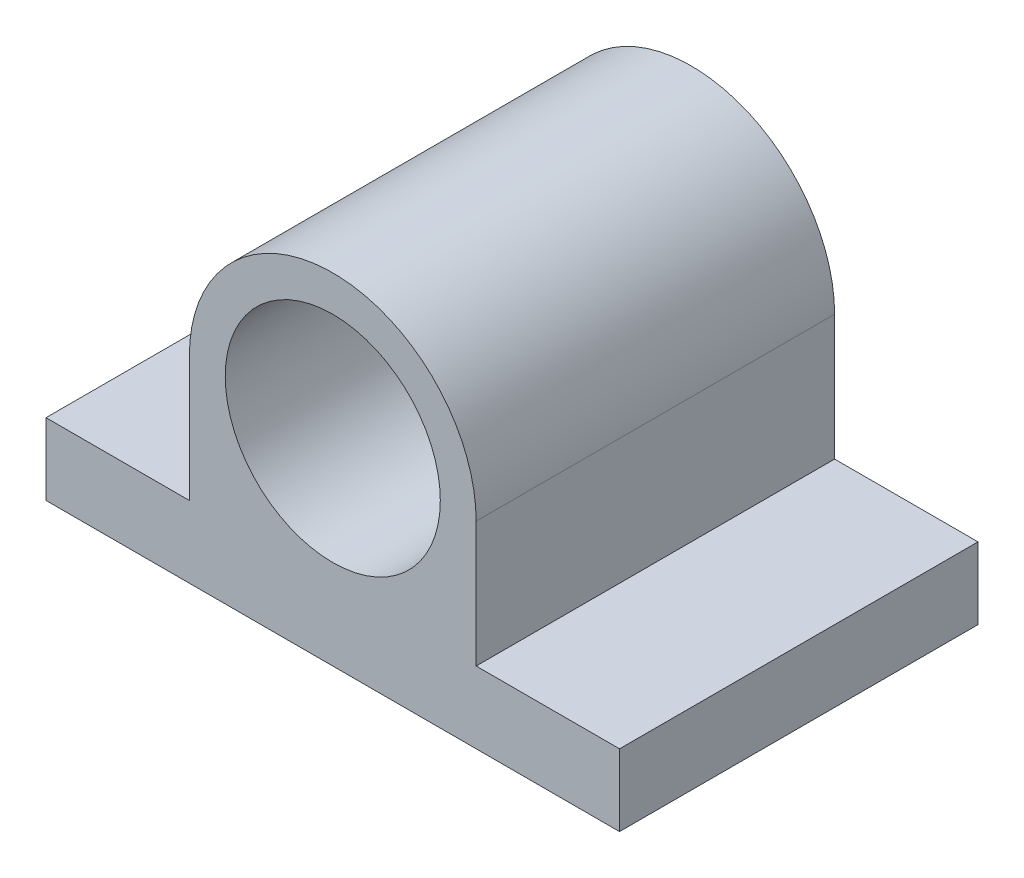
ISO-10303-21;
HEADER;
FILE_DESCRIPTION(('STEP AP214'),'2;1');
FILE_NAME('part.step','',(''),(''),'','','');
FILE_SCHEMA(('AUTOMOTIVE_DESIGN { 1 0 10303 214 1 1 1 1 }'));
ENDSEC;
DATA;
#1=APPLICATION_CONTEXT('core data for automotive mechanical design processes');
#2=APPLICATION_PROTOCOL_DEFINITION('international standard','automotive_design',2000,#1);
#3=PRODUCT_CONTEXT('',#1,'mechanical');
#4=PRODUCT('Part','Part','',(#3));
#5=PRODUCT_RELATED_PRODUCT_CATEGORY('part','',(#4));
#6=PRODUCT_DEFINITION_FORMATION('','',#4);
#7=PRODUCT_DEFINITION_CONTEXT('part definition',#1,'design');
#8=PRODUCT_DEFINITION('design','',#6,#7);
#9=PRODUCT_DEFINITION_SHAPE('','',#8);
#10=(LENGTH_UNIT() NAMED_UNIT(*) SI_UNIT(.MILLI.,.METRE.));
#11=(NAMED_UNIT(*) PLANE_ANGLE_UNIT() SI_UNIT($,.RADIAN.));
#12=(NAMED_UNIT(*) SI_UNIT($,.STERADIAN.) SOLID_ANGLE_UNIT());
#13=UNCERTAINTY_MEASURE_WITH_UNIT(LENGTH_MEASURE(1.E-05),#10,'distance_accuracy_value','');
#14=(GEOMETRIC_REPRESENTATION_CONTEXT(3) GLOBAL_UNCERTAINTY_ASSIGNED_CONTEXT((#13)) GLOBAL_UNIT_ASSIGNED_CONTEXT((#10,
#11,#12)) REPRESENTATION_CONTEXT('',''));
#15=CARTESIAN_POINT('',(0.,0.,0.));
#16=DIRECTION('',(0.,0.,1.));
#17=DIRECTION('',(1.,0.,0.));
#18=AXIS2_PLACEMENT_3D('',#15,#16,#17);
#19=CARTESIAN_POINT('',(40.,27.5,50.));
#20=DIRECTION('',(0.,0.,1.));
#21=DIRECTION('',(1.,0.,0.));
#22=AXIS2_PLACEMENT_3D('',#19,#20,#21);
#23=PLANE('',#22);
#24=DIRECTION('',(0.,-1.,0.));
#25=VECTOR('',#24,1.);
#26=CARTESIAN_POINT('',(0.,0.,50.));
#27=LINE('',#26,#25);
#28=CARTESIAN_POINT('',(0.,10.,50.));
#29=VERTEX_POINT('',#28);
#30=CARTESIAN_POINT('',(0.,0.,50.));
#31=VERTEX_POINT('',#30);
#32=EDGE_CURVE('E145',#29,#31,#27,.T.);
#33=ORIENTED_EDGE('',*,*,#32,.T.);
#34=DIRECTION('',(1.,0.,0.));
#35=VECTOR('',#34,1.);
#36=CARTESIAN_POINT('',(0.,0.,50.));
#37=LINE('',#36,#35);
#38=CARTESIAN_POINT('',(80.,0.,50.));
#39=VERTEX_POINT('',#38);
#40=EDGE_CURVE('E93',#31,#39,#37,.T.);
#41=ORIENTED_EDGE('',*,*,#40,.T.);
#42=DIRECTION('',(0.,1.,0.));
#43=VECTOR('',#42,1.);
#44=CARTESIAN_POINT('',(80.,0.,50.));
#45=LINE('',#44,#43);
#46=CARTESIAN_POINT('',(80.,10.,50.));
#47=VERTEX_POINT('',#46);
#48=EDGE_CURVE('E160',#39,#47,#45,.T.);
#49=ORIENTED_EDGE('',*,*,#48,.T.);
#50=DIRECTION('',(-1.,0.,0.));
#51=VECTOR('',#50,1.);
#52=CARTESIAN_POINT('',(60.,10.,50.));
#53=LINE('',#52,#51);
#54=CARTESIAN_POINT('',(60.,10.,50.));
#55=VERTEX_POINT('',#54);
#56=EDGE_CURVE('E173',#47,#55,#53,.T.);
#57=ORIENTED_EDGE('',*,*,#56,.T.);
#58=DIRECTION('',(0.,1.,0.));
#59=VECTOR('',#58,1.);
#60=CARTESIAN_POINT('',(60.,10.,50.));
#61=LINE('',#60,#59);
#62=CARTESIAN_POINT('',(60.,27.5,50.));
#63=VERTEX_POINT('',#62);
#64=EDGE_CURVE('E112',#55,#63,#61,.T.);
#65=ORIENTED_EDGE('',*,*,#64,.T.);
#66=CARTESIAN_POINT('',(40.,27.5,50.));
#67=DIRECTION('',(0.,0.,1.));
#68=DIRECTION('',(1.,0.,0.));
#69=AXIS2_PLACEMENT_3D('',#66,#67,#68);
#70=CIRCLE('',#69,20.);
#71=CARTESIAN_POINT('',(20.,27.5,50.));
#72=VERTEX_POINT('',#71);
#73=EDGE_CURVE('E106',#63,#72,#70,.T.);
#74=ORIENTED_EDGE('',*,*,#73,.T.);
#75=DIRECTION('',(0.,-1.,0.));
#76=VECTOR('',#75,1.);
#77=CARTESIAN_POINT('',(20.,10.,50.));
#78=LINE('',#77,#76);
#79=CARTESIAN_POINT('',(20.,10.,50.));
#80=VERTEX_POINT('',#79);
#81=EDGE_CURVE('E110',#72,#80,#78,.T.);
#82=ORIENTED_EDGE('',*,*,#81,.T.);
#83=DIRECTION('',(-1.,0.,0.));
#84=VECTOR('',#83,1.);
#85=CARTESIAN_POINT('',(0.,10.,50.));
#86=LINE('',#85,#84);
#87=EDGE_CURVE('E50',#80,#29,#86,.T.);
#88=ORIENTED_EDGE('',*,*,#87,.T.);
#89=EDGE_LOOP('',(#33,#41,#49,#57,#65,#74,#82,#88));
#90=FACE_BOUND('',#89,.T.);
#91=CARTESIAN_POINT('',(40.,27.5,50.));
#92=DIRECTION('',(0.,0.,1.));
#93=DIRECTION('',(1.,0.,0.));
#94=AXIS2_PLACEMENT_3D('',#91,#92,#93);
#95=CIRCLE('',#94,15.);
#96=CARTESIAN_POINT('',(55.,27.5,50.));
#97=VERTEX_POINT('',#96);
#98=EDGE_CURVE('E134',#97,#97,#95,.T.);
#99=ORIENTED_EDGE('',*,*,#98,.F.);
#100=EDGE_LOOP('',(#99));
#101=FACE_BOUND('',#100,.T.);
#102=ADVANCED_FACE('F33',(#90,#101),#23,.T.);
#103=CARTESIAN_POINT('',(40.,27.5,0.));
#104=DIRECTION('',(0.,0.,1.));
#105=DIRECTION('',(1.,0.,0.));
#106=AXIS2_PLACEMENT_3D('',#103,#104,#105);
#107=PLANE('',#106);
#108=DIRECTION('',(0.,-1.,0.));
#109=VECTOR('',#108,1.);
#110=CARTESIAN_POINT('',(0.,0.,0.));
#111=LINE('',#110,#109);
#112=CARTESIAN_POINT('',(0.,10.,0.));
#113=VERTEX_POINT('',#112);
#114=CARTESIAN_POINT('',(0.,0.,0.));
#115=VERTEX_POINT('',#114);
#116=EDGE_CURVE('E130',#113,#115,#111,.T.);
#117=ORIENTED_EDGE('',*,*,#116,.F.);
#118=DIRECTION('',(-1.,0.,0.));
#119=VECTOR('',#118,1.);
#120=CARTESIAN_POINT('',(0.,10.,0.));
#121=LINE('',#120,#119);
#122=CARTESIAN_POINT('',(20.,10.,0.));
#123=VERTEX_POINT('',#122);
#124=EDGE_CURVE('E85',#123,#113,#121,.T.);
#125=ORIENTED_EDGE('',*,*,#124,.F.);
#126=DIRECTION('',(0.,-1.,0.));
#127=VECTOR('',#126,1.);
#128=CARTESIAN_POINT('',(20.,10.,0.));
#129=LINE('',#128,#127);
#130=CARTESIAN_POINT('',(20.,27.5,0.));
#131=VERTEX_POINT('',#130);
#132=EDGE_CURVE('E79',#131,#123,#129,.T.);
#133=ORIENTED_EDGE('',*,*,#132,.F.);
#134=CARTESIAN_POINT('',(40.,27.5,0.));
#135=DIRECTION('',(0.,0.,1.));
#136=DIRECTION('',(1.,0.,0.));
#137=AXIS2_PLACEMENT_3D('',#134,#135,#136);
#138=CIRCLE('',#137,20.);
#139=CARTESIAN_POINT('',(60.,27.5,0.));
#140=VERTEX_POINT('',#139);
#141=EDGE_CURVE('E120',#140,#131,#138,.T.);
#142=ORIENTED_EDGE('',*,*,#141,.F.);
#143=DIRECTION('',(0.,1.,0.));
#144=VECTOR('',#143,1.);
#145=CARTESIAN_POINT('',(60.,10.,0.));
#146=LINE('',#145,#144);
#147=CARTESIAN_POINT('',(60.,10.,0.));
#148=VERTEX_POINT('',#147);
#149=EDGE_CURVE('E140',#148,#140,#146,.T.);
#150=ORIENTED_EDGE('',*,*,#149,.F.);
#151=DIRECTION('',(-1.,0.,0.));
#152=VECTOR('',#151,1.);
#153=CARTESIAN_POINT('',(60.,10.,0.));
#154=LINE('',#153,#152);
#155=CARTESIAN_POINT('',(80.,10.,0.));
#156=VERTEX_POINT('',#155);
#157=EDGE_CURVE('E138',#156,#148,#154,.T.);
#158=ORIENTED_EDGE('',*,*,#157,.F.);
#159=DIRECTION('',(0.,1.,0.));
#160=VECTOR('',#159,1.);
#161=CARTESIAN_POINT('',(80.,0.,0.));
#162=LINE('',#161,#160);
#163=CARTESIAN_POINT('',(80.,0.,0.));
#164=VERTEX_POINT('',#163);
#165=EDGE_CURVE('E136',#164,#156,#162,.T.);
#166=ORIENTED_EDGE('',*,*,#165,.F.);
#167=DIRECTION('',(1.,0.,0.));
#168=VECTOR('',#167,1.);
#169=CARTESIAN_POINT('',(0.,0.,0.));
#170=LINE('',#169,#168);
#171=EDGE_CURVE('E133',#115,#164,#170,.T.);
#172=ORIENTED_EDGE('',*,*,#171,.F.);
#173=EDGE_LOOP('',(#117,#125,#133,#142,#150,#158,#166,#172));
#174=FACE_BOUND('',#173,.T.);
#175=CARTESIAN_POINT('',(40.,27.5,0.));
#176=DIRECTION('',(0.,0.,1.));
#177=DIRECTION('',(1.,0.,0.));
#178=AXIS2_PLACEMENT_3D('',#175,#176,#177);
#179=CIRCLE('',#178,15.);
#180=CARTESIAN_POINT('',(55.,27.5,0.));
#181=VERTEX_POINT('',#180);
#182=EDGE_CURVE('E179',#181,#181,#179,.T.);
#183=ORIENTED_EDGE('',*,*,#182,.T.);
#184=EDGE_LOOP('',(#183));
#185=FACE_BOUND('',#184,.T.);
#186=ADVANCED_FACE('F164',(#174,#185),#107,.F.);
#187=CARTESIAN_POINT('',(0.,0.,50.));
#188=DIRECTION('',(1.,0.,0.));
#189=DIRECTION('',(0.,1.,0.));
#190=AXIS2_PLACEMENT_3D('',#187,#188,#189);
#191=PLANE('',#190);
#192=ORIENTED_EDGE('',*,*,#116,.T.);
#193=DIRECTION('',(0.,0.,-1.));
#194=VECTOR('',#193,1.);
#195=CARTESIAN_POINT('',(0.,0.,50.));
#196=LINE('',#195,#194);
#197=EDGE_CURVE('E11',#31,#115,#196,.T.);
#198=ORIENTED_EDGE('',*,*,#197,.F.);
#199=ORIENTED_EDGE('',*,*,#32,.F.);
#200=DIRECTION('',(0.,0.,-1.));
#201=VECTOR('',#200,1.);
#202=CARTESIAN_POINT('',(0.,10.,50.));
#203=LINE('',#202,#201);
#204=EDGE_CURVE('E126',#29,#113,#203,.T.);
#205=ORIENTED_EDGE('',*,*,#204,.T.);
#206=EDGE_LOOP('',(#192,#198,#199,#205));
#207=FACE_BOUND('',#206,.T.);
#208=ADVANCED_FACE('F35',(#207),#191,.F.);
#209=CARTESIAN_POINT('',(0.,0.,50.));
#210=DIRECTION('',(0.,1.,0.));
#211=DIRECTION('',(-1.,0.,0.));
#212=AXIS2_PLACEMENT_3D('',#209,#210,#211);
#213=PLANE('',#212);
#214=ORIENTED_EDGE('',*,*,#171,.T.);
#215=DIRECTION('',(0.,0.,-1.));
#216=VECTOR('',#215,1.);
#217=CARTESIAN_POINT('',(80.,0.,50.));
#218=LINE('',#217,#216);
#219=EDGE_CURVE('E42',#39,#164,#218,.T.);
#220=ORIENTED_EDGE('',*,*,#219,.F.);
#221=ORIENTED_EDGE('',*,*,#40,.F.);
#222=ORIENTED_EDGE('',*,*,#197,.T.);
#223=EDGE_LOOP('',(#214,#220,#221,#222));
#224=FACE_BOUND('',#223,.T.);
#225=ADVANCED_FACE('F207',(#224),#213,.F.);
#226=CARTESIAN_POINT('',(80.,0.,50.));
#227=DIRECTION('',(-1.,0.,0.));
#228=DIRECTION('',(0.,0.,1.));
#229=AXIS2_PLACEMENT_3D('',#226,#227,#228);
#230=PLANE('',#229);
#231=ORIENTED_EDGE('',*,*,#165,.T.);
#232=DIRECTION('',(0.,0.,-1.));
#233=VECTOR('',#232,1.);
#234=CARTESIAN_POINT('',(80.,10.,50.));
#235=LINE('',#234,#233);
#236=EDGE_CURVE('E152',#47,#156,#235,.T.);
#237=ORIENTED_EDGE('',*,*,#236,.F.);
#238=ORIENTED_EDGE('',*,*,#48,.F.);
#239=ORIENTED_EDGE('',*,*,#219,.T.);
#240=EDGE_LOOP('',(#231,#237,#238,#239));
#241=FACE_BOUND('',#240,.T.);
#242=ADVANCED_FACE('F158',(#241),#230,.F.);
#243=CARTESIAN_POINT('',(60.,10.,50.));
#244=DIRECTION('',(0.,-1.,0.));
#245=DIRECTION('',(1.,0.,0.));
#246=AXIS2_PLACEMENT_3D('',#243,#244,#245);
#247=PLANE('',#246);
#248=ORIENTED_EDGE('',*,*,#157,.T.);
#249=DIRECTION('',(0.,0.,-1.));
#250=VECTOR('',#249,1.);
#251=CARTESIAN_POINT('',(60.,10.,50.));
#252=LINE('',#251,#250);
#253=EDGE_CURVE('E149',#55,#148,#252,.T.);
#254=ORIENTED_EDGE('',*,*,#253,.F.);
#255=ORIENTED_EDGE('',*,*,#56,.F.);
#256=ORIENTED_EDGE('',*,*,#236,.T.);
#257=EDGE_LOOP('',(#248,#254,#255,#256));
#258=FACE_BOUND('',#257,.T.);
#259=ADVANCED_FACE('F169',(#258),#247,.F.);
#260=CARTESIAN_POINT('',(60.,10.,50.));
#261=DIRECTION('',(-1.,0.,0.));
#262=DIRECTION('',(0.,0.,1.));
#263=AXIS2_PLACEMENT_3D('',#260,#261,#262);
#264=PLANE('',#263);
#265=ORIENTED_EDGE('',*,*,#149,.T.);
#266=DIRECTION('',(0.,0.,-1.));
#267=VECTOR('',#266,1.);
#268=CARTESIAN_POINT('',(60.,27.5,50.));
#269=LINE('',#268,#267);
#270=EDGE_CURVE('E121',#63,#140,#269,.T.);
#271=ORIENTED_EDGE('',*,*,#270,.F.);
#272=ORIENTED_EDGE('',*,*,#64,.F.);
#273=ORIENTED_EDGE('',*,*,#253,.T.);
#274=EDGE_LOOP('',(#265,#271,#272,#273));
#275=FACE_BOUND('',#274,.T.);
#276=ADVANCED_FACE('F172',(#275),#264,.F.);
#277=CARTESIAN_POINT('',(40.,27.5,50.));
#278=DIRECTION('',(0.,0.,-1.));
#279=DIRECTION('',(-1.,0.,0.));
#280=AXIS2_PLACEMENT_3D('',#277,#278,#279);
#281=CYLINDRICAL_SURFACE('',#280,20.);
#282=ORIENTED_EDGE('',*,*,#141,.T.);
#283=DIRECTION('',(0.,0.,-1.));
#284=VECTOR('',#283,1.);
#285=CARTESIAN_POINT('',(20.,27.5,50.));
#286=LINE('',#285,#284);
#287=EDGE_CURVE('E117',#72,#131,#286,.T.);
#288=ORIENTED_EDGE('',*,*,#287,.F.);
#289=ORIENTED_EDGE('',*,*,#73,.F.);
#290=ORIENTED_EDGE('',*,*,#270,.T.);
#291=EDGE_LOOP('',(#282,#288,#289,#290));
#292=FACE_BOUND('',#291,.T.);
#293=ADVANCED_FACE('F118',(#292),#281,.T.);
#294=CARTESIAN_POINT('',(20.,10.,50.));
#295=DIRECTION('',(1.,0.,0.));
#296=DIRECTION('',(0.,1.,0.));
#297=AXIS2_PLACEMENT_3D('',#294,#295,#296);
#298=PLANE('',#297);
#299=ORIENTED_EDGE('',*,*,#132,.T.);
#300=DIRECTION('',(0.,0.,-1.));
#301=VECTOR('',#300,1.);
#302=CARTESIAN_POINT('',(20.,10.,50.));
#303=LINE('',#302,#301);
#304=EDGE_CURVE('E122',#80,#123,#303,.T.);
#305=ORIENTED_EDGE('',*,*,#304,.F.);
#306=ORIENTED_EDGE('',*,*,#81,.F.);
#307=ORIENTED_EDGE('',*,*,#287,.T.);
#308=EDGE_LOOP('',(#299,#305,#306,#307));
#309=FACE_BOUND('',#308,.T.);
#310=ADVANCED_FACE('F124',(#309),#298,.F.);
#311=CARTESIAN_POINT('',(0.,10.,50.));
#312=DIRECTION('',(0.,-1.,0.));
#313=DIRECTION('',(1.,0.,0.));
#314=AXIS2_PLACEMENT_3D('',#311,#312,#313);
#315=PLANE('',#314);
#316=ORIENTED_EDGE('',*,*,#124,.T.);
#317=ORIENTED_EDGE('',*,*,#204,.F.);
#318=ORIENTED_EDGE('',*,*,#87,.F.);
#319=ORIENTED_EDGE('',*,*,#304,.T.);
#320=EDGE_LOOP('',(#316,#317,#318,#319));
#321=FACE_BOUND('',#320,.T.);
#322=ADVANCED_FACE('F195',(#321),#315,.F.);
#323=CARTESIAN_POINT('',(40.,27.5,50.));
#324=DIRECTION('',(0.,0.,-1.));
#325=DIRECTION('',(-1.,0.,0.));
#326=AXIS2_PLACEMENT_3D('',#323,#324,#325);
#327=CYLINDRICAL_SURFACE('',#326,15.);
#328=ORIENTED_EDGE('',*,*,#98,.T.);
#329=EDGE_LOOP('',(#328));
#330=FACE_BOUND('',#329,.T.);
#331=ORIENTED_EDGE('',*,*,#182,.F.);
#332=EDGE_LOOP('',(#331));
#333=FACE_BOUND('',#332,.T.);
#334=ADVANCED_FACE('F185',(#330,#333),#327,.F.);
#335=CLOSED_SHELL('',(#102,#186,#208,#225,#242,#259,#276,#293,#310,#322,#334));
#336=MANIFOLD_SOLID_BREP('B2',#335);
#337=ADVANCED_BREP_SHAPE_REPRESENTATION('',(#18,#336),#14);
#338=SHAPE_DEFINITION_REPRESENTATION(#9,#337);
ENDSEC;
END-ISO-10303-21;
